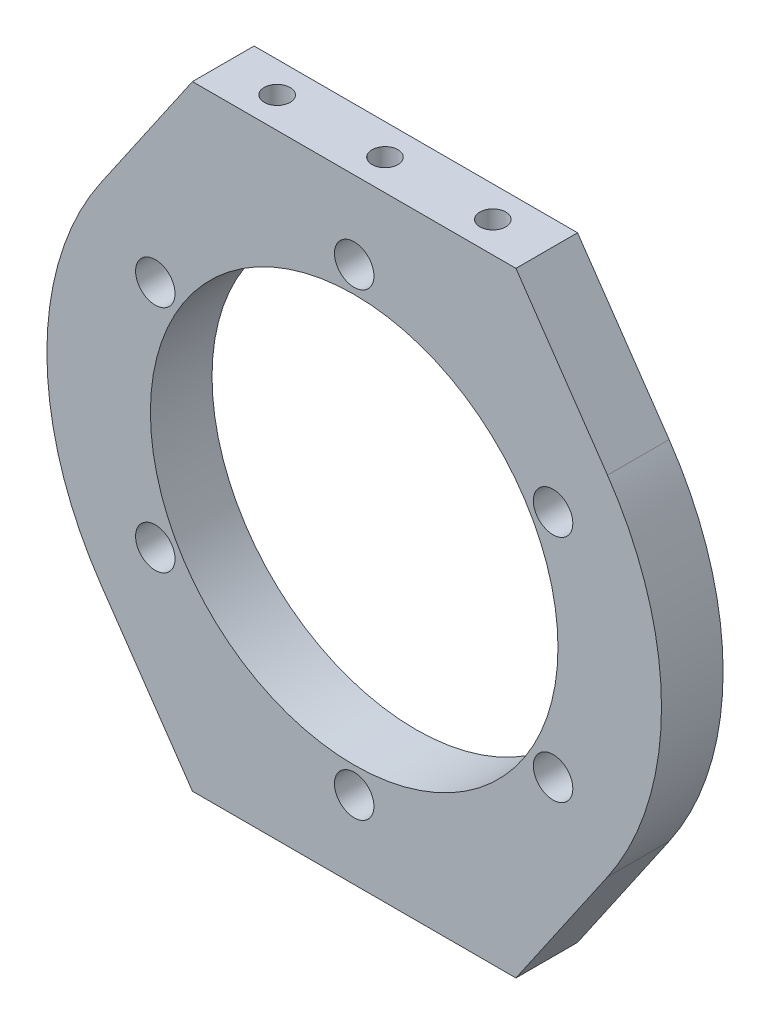
ISO-10303-21;
HEADER;
FILE_DESCRIPTION(('STEP AP214'),'2;1');
FILE_NAME('part.step','',(''),(''),'','','');
FILE_SCHEMA(('AUTOMOTIVE_DESIGN { 1 0 10303 214 1 1 1 1 }'));
ENDSEC;
DATA;
#1=APPLICATION_CONTEXT('core data for automotive mechanical design processes');
#2=APPLICATION_PROTOCOL_DEFINITION('international standard','automotive_design',2000,#1);
#3=PRODUCT_CONTEXT('',#1,'mechanical');
#4=PRODUCT('Part','Part','',(#3));
#5=PRODUCT_RELATED_PRODUCT_CATEGORY('part','',(#4));
#6=PRODUCT_DEFINITION_FORMATION('','',#4);
#7=PRODUCT_DEFINITION_CONTEXT('part definition',#1,'design');
#8=PRODUCT_DEFINITION('design','',#6,#7);
#9=PRODUCT_DEFINITION_SHAPE('','',#8);
#10=(LENGTH_UNIT() NAMED_UNIT(*) SI_UNIT(.MILLI.,.METRE.));
#11=(NAMED_UNIT(*) PLANE_ANGLE_UNIT() SI_UNIT($,.RADIAN.));
#12=(NAMED_UNIT(*) SI_UNIT($,.STERADIAN.) SOLID_ANGLE_UNIT());
#13=UNCERTAINTY_MEASURE_WITH_UNIT(LENGTH_MEASURE(1.E-05),#10,'distance_accuracy_value','');
#14=(GEOMETRIC_REPRESENTATION_CONTEXT(3) GLOBAL_UNCERTAINTY_ASSIGNED_CONTEXT((#13)) GLOBAL_UNIT_ASSIGNED_CONTEXT((#10,
#11,#12)) REPRESENTATION_CONTEXT('',''));
#15=CARTESIAN_POINT('',(0.,0.,0.));
#16=DIRECTION('',(0.,0.,1.));
#17=DIRECTION('',(1.,0.,0.));
#18=AXIS2_PLACEMENT_3D('',#15,#16,#17);
#19=CARTESIAN_POINT('',(-39.1540130151844,26.8926247288503,-9.525));
#20=DIRECTION('',(-0.824295010845986,0.566160520607376,0.));
#21=DIRECTION('',(-0.566160520607376,-0.824295010845986,0.));
#22=AXIS2_PLACEMENT_3D('',#19,#20,#21);
#23=PLANE('',#22);
#24=DIRECTION('',(-0.566160520607376,-0.824295010845986,0.));
#25=VECTOR('',#24,1.);
#26=CARTESIAN_POINT('',(-39.1540130151844,26.8926247288503,0.));
#27=LINE('',#26,#25);
#28=CARTESIAN_POINT('',(-25.,47.5,0.));
#29=VERTEX_POINT('',#28);
#30=CARTESIAN_POINT('',(-39.1540130151844,26.8926247288503,0.));
#31=VERTEX_POINT('',#30);
#32=EDGE_CURVE('E139',#29,#31,#27,.T.);
#33=ORIENTED_EDGE('',*,*,#32,.F.);
#34=DIRECTION('',(0.,0.,1.));
#35=VECTOR('',#34,1.);
#36=CARTESIAN_POINT('',(-25.,47.5,-9.525));
#37=LINE('',#36,#35);
#38=CARTESIAN_POINT('',(-25.,47.5,-9.525));
#39=VERTEX_POINT('',#38);
#40=EDGE_CURVE('E11',#39,#29,#37,.T.);
#41=ORIENTED_EDGE('',*,*,#40,.F.);
#42=DIRECTION('',(-0.566160520607376,-0.824295010845986,0.));
#43=VECTOR('',#42,1.);
#44=CARTESIAN_POINT('',(-39.1540130151844,26.8926247288503,-9.525));
#45=LINE('',#44,#43);
#46=CARTESIAN_POINT('',(-39.1540130151844,26.8926247288503,-9.525));
#47=VERTEX_POINT('',#46);
#48=EDGE_CURVE('E160',#39,#47,#45,.T.);
#49=ORIENTED_EDGE('',*,*,#48,.T.);
#50=DIRECTION('',(0.,0.,1.));
#51=VECTOR('',#50,1.);
#52=CARTESIAN_POINT('',(-39.1540130151844,26.8926247288503,-9.525));
#53=LINE('',#52,#51);
#54=EDGE_CURVE('E42',#47,#31,#53,.T.);
#55=ORIENTED_EDGE('',*,*,#54,.T.);
#56=EDGE_LOOP('',(#33,#41,#49,#55));
#57=FACE_BOUND('',#56,.T.);
#58=ADVANCED_FACE('F39',(#57),#23,.T.);
#59=CARTESIAN_POINT('',(-25.,47.5,-9.525));
#60=DIRECTION('',(0.,1.,0.));
#61=DIRECTION('',(-1.,0.,0.));
#62=AXIS2_PLACEMENT_3D('',#59,#60,#61);
#63=PLANE('',#62);
#64=CARTESIAN_POINT('',(-16.67,47.5,-4.7625));
#65=DIRECTION('',(0.,1.,0.));
#66=DIRECTION('',(0.,0.,1.));
#67=AXIS2_PLACEMENT_3D('',#64,#65,#66);
#68=CIRCLE('',#67,1.99999999999999);
#69=CARTESIAN_POINT('',(-16.67,47.5,-2.76250000000001));
#70=VERTEX_POINT('',#69);
#71=EDGE_CURVE('E310',#70,#70,#68,.T.);
#72=ORIENTED_EDGE('',*,*,#71,.F.);
#73=EDGE_LOOP('',(#72));
#74=FACE_BOUND('',#73,.T.);
#75=CARTESIAN_POINT('',(0.,47.5,-4.7625));
#76=DIRECTION('',(0.,1.,0.));
#77=DIRECTION('',(0.,0.,1.));
#78=AXIS2_PLACEMENT_3D('',#75,#76,#77);
#79=CIRCLE('',#78,1.99999999999999);
#80=CARTESIAN_POINT('',(0.,47.5,-2.76250000000001));
#81=VERTEX_POINT('',#80);
#82=EDGE_CURVE('E316',#81,#81,#79,.T.);
#83=ORIENTED_EDGE('',*,*,#82,.F.);
#84=EDGE_LOOP('',(#83));
#85=FACE_BOUND('',#84,.T.);
#86=CARTESIAN_POINT('',(16.67,47.5,-4.7625));
#87=DIRECTION('',(0.,1.,0.));
#88=DIRECTION('',(0.,0.,1.));
#89=AXIS2_PLACEMENT_3D('',#86,#87,#88);
#90=CIRCLE('',#89,1.99999999999999);
#91=CARTESIAN_POINT('',(16.67,47.5,-2.76250000000001));
#92=VERTEX_POINT('',#91);
#93=EDGE_CURVE('E322',#92,#92,#90,.T.);
#94=ORIENTED_EDGE('',*,*,#93,.F.);
#95=EDGE_LOOP('',(#94));
#96=FACE_BOUND('',#95,.T.);
#97=DIRECTION('',(-1.,0.,0.));
#98=VECTOR('',#97,1.);
#99=CARTESIAN_POINT('',(-25.,47.5,0.));
#100=LINE('',#99,#98);
#101=CARTESIAN_POINT('',(25.,47.5,0.));
#102=VERTEX_POINT('',#101);
#103=EDGE_CURVE('E158',#102,#29,#100,.T.);
#104=ORIENTED_EDGE('',*,*,#103,.F.);
#105=DIRECTION('',(0.,0.,1.));
#106=VECTOR('',#105,1.);
#107=CARTESIAN_POINT('',(25.,47.5,-9.525));
#108=LINE('',#107,#106);
#109=CARTESIAN_POINT('',(25.,47.5,-9.525));
#110=VERTEX_POINT('',#109);
#111=EDGE_CURVE('E48',#110,#102,#108,.T.);
#112=ORIENTED_EDGE('',*,*,#111,.F.);
#113=DIRECTION('',(-1.,0.,0.));
#114=VECTOR('',#113,1.);
#115=CARTESIAN_POINT('',(-25.,47.5,-9.525));
#116=LINE('',#115,#114);
#117=EDGE_CURVE('E129',#110,#39,#116,.T.);
#118=ORIENTED_EDGE('',*,*,#117,.T.);
#119=ORIENTED_EDGE('',*,*,#40,.T.);
#120=EDGE_LOOP('',(#104,#112,#118,#119));
#121=FACE_BOUND('',#120,.T.);
#122=ADVANCED_FACE('F172',(#74,#85,#96,#121),#63,.T.);
#123=CARTESIAN_POINT('',(39.1540130151844,26.8926247288503,-9.525));
#124=DIRECTION('',(0.824295010845986,0.566160520607376,0.));
#125=DIRECTION('',(-0.566160520607376,0.824295010845986,0.));
#126=AXIS2_PLACEMENT_3D('',#123,#124,#125);
#127=PLANE('',#126);
#128=DIRECTION('',(-0.566160520607376,0.824295010845986,0.));
#129=VECTOR('',#128,1.);
#130=CARTESIAN_POINT('',(39.1540130151844,26.8926247288503,0.));
#131=LINE('',#130,#129);
#132=CARTESIAN_POINT('',(39.1540130151844,26.8926247288503,0.));
#133=VERTEX_POINT('',#132);
#134=EDGE_CURVE('E116',#133,#102,#131,.T.);
#135=ORIENTED_EDGE('',*,*,#134,.F.);
#136=DIRECTION('',(0.,0.,1.));
#137=VECTOR('',#136,1.);
#138=CARTESIAN_POINT('',(39.1540130151844,26.8926247288503,-9.525));
#139=LINE('',#138,#137);
#140=CARTESIAN_POINT('',(39.1540130151844,26.8926247288503,-9.525));
#141=VERTEX_POINT('',#140);
#142=EDGE_CURVE('E111',#141,#133,#139,.T.);
#143=ORIENTED_EDGE('',*,*,#142,.F.);
#144=DIRECTION('',(-0.566160520607376,0.824295010845986,0.));
#145=VECTOR('',#144,1.);
#146=CARTESIAN_POINT('',(39.1540130151844,26.8926247288503,-9.525));
#147=LINE('',#146,#145);
#148=EDGE_CURVE('E114',#141,#110,#147,.T.);
#149=ORIENTED_EDGE('',*,*,#148,.T.);
#150=ORIENTED_EDGE('',*,*,#111,.T.);
#151=EDGE_LOOP('',(#135,#143,#149,#150));
#152=FACE_BOUND('',#151,.T.);
#153=ADVANCED_FACE('F113',(#152),#127,.T.);
#154=CARTESIAN_POINT('',(0.,0.,-9.525));
#155=DIRECTION('',(0.,0.,1.));
#156=DIRECTION('',(1.,0.,0.));
#157=AXIS2_PLACEMENT_3D('',#154,#155,#156);
#158=CYLINDRICAL_SURFACE('',#157,47.5);
#159=CARTESIAN_POINT('',(0.,0.,0.));
#160=DIRECTION('',(0.,0.,1.));
#161=DIRECTION('',(1.,0.,0.));
#162=AXIS2_PLACEMENT_3D('',#159,#160,#161);
#163=CIRCLE('',#162,47.5);
#164=CARTESIAN_POINT('',(39.1540130151844,-26.8926247288503,0.));
#165=VERTEX_POINT('',#164);
#166=EDGE_CURVE('E155',#165,#133,#163,.T.);
#167=ORIENTED_EDGE('',*,*,#166,.F.);
#168=DIRECTION('',(0.,0.,1.));
#169=VECTOR('',#168,1.);
#170=CARTESIAN_POINT('',(39.1540130151844,-26.8926247288503,-9.525));
#171=LINE('',#170,#169);
#172=CARTESIAN_POINT('',(39.1540130151844,-26.8926247288503,-9.525));
#173=VERTEX_POINT('',#172);
#174=EDGE_CURVE('E121',#173,#165,#171,.T.);
#175=ORIENTED_EDGE('',*,*,#174,.F.);
#176=CARTESIAN_POINT('',(0.,0.,-9.525));
#177=DIRECTION('',(0.,0.,1.));
#178=DIRECTION('',(1.,0.,0.));
#179=AXIS2_PLACEMENT_3D('',#176,#177,#178);
#180=CIRCLE('',#179,47.5);
#181=EDGE_CURVE('E127',#173,#141,#180,.T.);
#182=ORIENTED_EDGE('',*,*,#181,.T.);
#183=ORIENTED_EDGE('',*,*,#142,.T.);
#184=EDGE_LOOP('',(#167,#175,#182,#183));
#185=FACE_BOUND('',#184,.T.);
#186=ADVANCED_FACE('F131',(#185),#158,.T.);
#187=CARTESIAN_POINT('',(39.1540130151844,-26.8926247288503,-9.525));
#188=DIRECTION('',(0.824295010845986,-0.566160520607376,0.));
#189=DIRECTION('',(0.566160520607376,0.824295010845986,0.));
#190=AXIS2_PLACEMENT_3D('',#187,#188,#189);
#191=PLANE('',#190);
#192=DIRECTION('',(0.566160520607376,0.824295010845986,0.));
#193=VECTOR('',#192,1.);
#194=CARTESIAN_POINT('',(39.1540130151844,-26.8926247288503,0.));
#195=LINE('',#194,#193);
#196=CARTESIAN_POINT('',(25.,-47.5,0.));
#197=VERTEX_POINT('',#196);
#198=EDGE_CURVE('E152',#197,#165,#195,.T.);
#199=ORIENTED_EDGE('',*,*,#198,.F.);
#200=DIRECTION('',(0.,0.,1.));
#201=VECTOR('',#200,1.);
#202=CARTESIAN_POINT('',(25.,-47.5,-9.525));
#203=LINE('',#202,#201);
#204=CARTESIAN_POINT('',(25.,-47.5,-9.525));
#205=VERTEX_POINT('',#204);
#206=EDGE_CURVE('E164',#205,#197,#203,.T.);
#207=ORIENTED_EDGE('',*,*,#206,.F.);
#208=DIRECTION('',(0.566160520607376,0.824295010845986,0.));
#209=VECTOR('',#208,1.);
#210=CARTESIAN_POINT('',(39.1540130151844,-26.8926247288503,-9.525));
#211=LINE('',#210,#209);
#212=EDGE_CURVE('E132',#205,#173,#211,.T.);
#213=ORIENTED_EDGE('',*,*,#212,.T.);
#214=ORIENTED_EDGE('',*,*,#174,.T.);
#215=EDGE_LOOP('',(#199,#207,#213,#214));
#216=FACE_BOUND('',#215,.T.);
#217=ADVANCED_FACE('F190',(#216),#191,.T.);
#218=CARTESIAN_POINT('',(-25.,-47.5,-9.525));
#219=DIRECTION('',(0.,-1.,0.));
#220=DIRECTION('',(1.,0.,0.));
#221=AXIS2_PLACEMENT_3D('',#218,#219,#220);
#222=PLANE('',#221);
#223=CARTESIAN_POINT('',(0.,-47.5,-4.7625));
#224=DIRECTION('',(0.,-1.,0.));
#225=DIRECTION('',(0.,0.,-1.));
#226=AXIS2_PLACEMENT_3D('',#223,#224,#225);
#227=CIRCLE('',#226,1.99999999999999);
#228=CARTESIAN_POINT('',(0.,-47.5,-6.76249999999999));
#229=VERTEX_POINT('',#228);
#230=EDGE_CURVE('E294',#229,#229,#227,.T.);
#231=ORIENTED_EDGE('',*,*,#230,.F.);
#232=EDGE_LOOP('',(#231));
#233=FACE_BOUND('',#232,.T.);
#234=CARTESIAN_POINT('',(-16.67,-47.5,-4.7625));
#235=DIRECTION('',(0.,-1.,0.));
#236=DIRECTION('',(0.,0.,-1.));
#237=AXIS2_PLACEMENT_3D('',#234,#235,#236);
#238=CIRCLE('',#237,1.99999999999999);
#239=CARTESIAN_POINT('',(-16.67,-47.5,-6.76249999999999));
#240=VERTEX_POINT('',#239);
#241=EDGE_CURVE('E296',#240,#240,#238,.T.);
#242=ORIENTED_EDGE('',*,*,#241,.F.);
#243=EDGE_LOOP('',(#242));
#244=FACE_BOUND('',#243,.T.);
#245=CARTESIAN_POINT('',(16.67,-47.5,-4.7625));
#246=DIRECTION('',(0.,-1.,0.));
#247=DIRECTION('',(0.,0.,-1.));
#248=AXIS2_PLACEMENT_3D('',#245,#246,#247);
#249=CIRCLE('',#248,1.99999999999999);
#250=CARTESIAN_POINT('',(16.67,-47.5,-6.76249999999999));
#251=VERTEX_POINT('',#250);
#252=EDGE_CURVE('E304',#251,#251,#249,.T.);
#253=ORIENTED_EDGE('',*,*,#252,.F.);
#254=EDGE_LOOP('',(#253));
#255=FACE_BOUND('',#254,.T.);
#256=DIRECTION('',(1.,0.,0.));
#257=VECTOR('',#256,1.);
#258=CARTESIAN_POINT('',(-25.,-47.5,0.));
#259=LINE('',#258,#257);
#260=CARTESIAN_POINT('',(-25.,-47.5,0.));
#261=VERTEX_POINT('',#260);
#262=EDGE_CURVE('E149',#261,#197,#259,.T.);
#263=ORIENTED_EDGE('',*,*,#262,.F.);
#264=DIRECTION('',(0.,0.,1.));
#265=VECTOR('',#264,1.);
#266=CARTESIAN_POINT('',(-25.,-47.5,-9.525));
#267=LINE('',#266,#265);
#268=CARTESIAN_POINT('',(-25.,-47.5,-9.525));
#269=VERTEX_POINT('',#268);
#270=EDGE_CURVE('E166',#269,#261,#267,.T.);
#271=ORIENTED_EDGE('',*,*,#270,.F.);
#272=DIRECTION('',(1.,0.,0.));
#273=VECTOR('',#272,1.);
#274=CARTESIAN_POINT('',(-25.,-47.5,-9.525));
#275=LINE('',#274,#273);
#276=EDGE_CURVE('E134',#269,#205,#275,.T.);
#277=ORIENTED_EDGE('',*,*,#276,.T.);
#278=ORIENTED_EDGE('',*,*,#206,.T.);
#279=EDGE_LOOP('',(#263,#271,#277,#278));
#280=FACE_BOUND('',#279,.T.);
#281=ADVANCED_FACE('F193',(#233,#244,#255,#280),#222,.T.);
#282=CARTESIAN_POINT('',(-39.1540130151844,-26.8926247288504,-9.525));
#283=DIRECTION('',(-0.824295010845986,-0.566160520607376,0.));
#284=DIRECTION('',(0.566160520607376,-0.824295010845986,0.));
#285=AXIS2_PLACEMENT_3D('',#282,#283,#284);
#286=PLANE('',#285);
#287=DIRECTION('',(0.566160520607376,-0.824295010845986,0.));
#288=VECTOR('',#287,1.);
#289=CARTESIAN_POINT('',(-39.1540130151844,-26.8926247288504,0.));
#290=LINE('',#289,#288);
#291=CARTESIAN_POINT('',(-39.1540130151844,-26.8926247288504,0.));
#292=VERTEX_POINT('',#291);
#293=EDGE_CURVE('E146',#292,#261,#290,.T.);
#294=ORIENTED_EDGE('',*,*,#293,.F.);
#295=DIRECTION('',(0.,0.,1.));
#296=VECTOR('',#295,1.);
#297=CARTESIAN_POINT('',(-39.1540130151844,-26.8926247288504,-9.525));
#298=LINE('',#297,#296);
#299=CARTESIAN_POINT('',(-39.1540130151844,-26.8926247288504,-9.525));
#300=VERTEX_POINT('',#299);
#301=EDGE_CURVE('E167',#300,#292,#298,.T.);
#302=ORIENTED_EDGE('',*,*,#301,.F.);
#303=DIRECTION('',(0.566160520607376,-0.824295010845986,0.));
#304=VECTOR('',#303,1.);
#305=CARTESIAN_POINT('',(-39.1540130151844,-26.8926247288504,-9.525));
#306=LINE('',#305,#304);
#307=EDGE_CURVE('E372',#300,#269,#306,.T.);
#308=ORIENTED_EDGE('',*,*,#307,.T.);
#309=ORIENTED_EDGE('',*,*,#270,.T.);
#310=EDGE_LOOP('',(#294,#302,#308,#309));
#311=FACE_BOUND('',#310,.T.);
#312=ADVANCED_FACE('F197',(#311),#286,.T.);
#313=CARTESIAN_POINT('',(0.,0.,-9.525));
#314=DIRECTION('',(0.,0.,1.));
#315=DIRECTION('',(1.,0.,0.));
#316=AXIS2_PLACEMENT_3D('',#313,#314,#315);
#317=CYLINDRICAL_SURFACE('',#316,47.5);
#318=CARTESIAN_POINT('',(0.,0.,0.));
#319=DIRECTION('',(0.,0.,1.));
#320=DIRECTION('',(1.,0.,0.));
#321=AXIS2_PLACEMENT_3D('',#318,#319,#320);
#322=CIRCLE('',#321,47.5);
#323=EDGE_CURVE('E142',#31,#292,#322,.T.);
#324=ORIENTED_EDGE('',*,*,#323,.F.);
#325=ORIENTED_EDGE('',*,*,#54,.F.);
#326=CARTESIAN_POINT('',(0.,0.,-9.525));
#327=DIRECTION('',(0.,0.,1.));
#328=DIRECTION('',(1.,0.,0.));
#329=AXIS2_PLACEMENT_3D('',#326,#327,#328);
#330=CIRCLE('',#329,47.5);
#331=EDGE_CURVE('E370',#47,#300,#330,.T.);
#332=ORIENTED_EDGE('',*,*,#331,.T.);
#333=ORIENTED_EDGE('',*,*,#301,.T.);
#334=EDGE_LOOP('',(#324,#325,#332,#333));
#335=FACE_BOUND('',#334,.T.);
#336=ADVANCED_FACE('F169',(#335),#317,.T.);
#337=CARTESIAN_POINT('',(0.,0.,-9.525));
#338=DIRECTION('',(0.,0.,1.));
#339=DIRECTION('',(1.,0.,0.));
#340=AXIS2_PLACEMENT_3D('',#337,#338,#339);
#341=PLANE('',#340);
#342=CARTESIAN_POINT('',(0.,0.,-9.525));
#343=DIRECTION('',(0.,0.,-1.));
#344=DIRECTION('',(-1.,0.,0.));
#345=AXIS2_PLACEMENT_3D('',#342,#343,#344);
#346=CIRCLE('',#345,31.5);
#347=CARTESIAN_POINT('',(-31.5,0.,-9.525));
#348=VERTEX_POINT('',#347);
#349=EDGE_CURVE('E328',#348,#348,#346,.T.);
#350=ORIENTED_EDGE('',*,*,#349,.F.);
#351=EDGE_LOOP('',(#350));
#352=FACE_BOUND('',#351,.T.);
#353=CARTESIAN_POINT('',(0.,35.5,-9.525));
#354=DIRECTION('',(0.,0.,1.));
#355=DIRECTION('',(1.,0.,0.));
#356=AXIS2_PLACEMENT_3D('',#353,#354,#355);
#357=CIRCLE('',#356,3.05);
#358=CARTESIAN_POINT('',(3.05,35.5,-9.525));
#359=VERTEX_POINT('',#358);
#360=EDGE_CURVE('E337',#359,#359,#357,.T.);
#361=ORIENTED_EDGE('',*,*,#360,.T.);
#362=EDGE_LOOP('',(#361));
#363=FACE_BOUND('',#362,.T.);
#364=CARTESIAN_POINT('',(30.7439018343476,17.75,-9.525));
#365=DIRECTION('',(0.,0.,1.));
#366=DIRECTION('',(1.,0.,0.));
#367=AXIS2_PLACEMENT_3D('',#364,#365,#366);
#368=CIRCLE('',#367,3.05);
#369=CARTESIAN_POINT('',(33.7939018343476,17.75,-9.525));
#370=VERTEX_POINT('',#369);
#371=EDGE_CURVE('E343',#370,#370,#368,.T.);
#372=ORIENTED_EDGE('',*,*,#371,.T.);
#373=EDGE_LOOP('',(#372));
#374=FACE_BOUND('',#373,.T.);
#375=CARTESIAN_POINT('',(30.7439018343476,-17.75,-9.525));
#376=DIRECTION('',(0.,0.,1.));
#377=DIRECTION('',(1.,0.,0.));
#378=AXIS2_PLACEMENT_3D('',#375,#376,#377);
#379=CIRCLE('',#378,3.05);
#380=CARTESIAN_POINT('',(33.7939018343476,-17.75,-9.525));
#381=VERTEX_POINT('',#380);
#382=EDGE_CURVE('E349',#381,#381,#379,.T.);
#383=ORIENTED_EDGE('',*,*,#382,.T.);
#384=EDGE_LOOP('',(#383));
#385=FACE_BOUND('',#384,.T.);
#386=CARTESIAN_POINT('',(0.,-35.5,-9.525));
#387=DIRECTION('',(0.,0.,1.));
#388=DIRECTION('',(1.,0.,0.));
#389=AXIS2_PLACEMENT_3D('',#386,#387,#388);
#390=CIRCLE('',#389,3.05);
#391=CARTESIAN_POINT('',(3.05,-35.5,-9.525));
#392=VERTEX_POINT('',#391);
#393=EDGE_CURVE('E355',#392,#392,#390,.T.);
#394=ORIENTED_EDGE('',*,*,#393,.T.);
#395=EDGE_LOOP('',(#394));
#396=FACE_BOUND('',#395,.T.);
#397=CARTESIAN_POINT('',(-30.7439018343476,-17.75,-9.525));
#398=DIRECTION('',(0.,0.,1.));
#399=DIRECTION('',(1.,0.,0.));
#400=AXIS2_PLACEMENT_3D('',#397,#398,#399);
#401=CIRCLE('',#400,3.05);
#402=CARTESIAN_POINT('',(-27.6939018343476,-17.75,-9.525));
#403=VERTEX_POINT('',#402);
#404=EDGE_CURVE('E361',#403,#403,#401,.T.);
#405=ORIENTED_EDGE('',*,*,#404,.T.);
#406=EDGE_LOOP('',(#405));
#407=FACE_BOUND('',#406,.T.);
#408=CARTESIAN_POINT('',(-30.7439018343476,17.75,-9.525));
#409=DIRECTION('',(0.,0.,1.));
#410=DIRECTION('',(1.,0.,0.));
#411=AXIS2_PLACEMENT_3D('',#408,#409,#410);
#412=CIRCLE('',#411,3.05);
#413=CARTESIAN_POINT('',(-27.6939018343476,17.75,-9.525));
#414=VERTEX_POINT('',#413);
#415=EDGE_CURVE('E143',#414,#414,#412,.T.);
#416=ORIENTED_EDGE('',*,*,#415,.T.);
#417=EDGE_LOOP('',(#416));
#418=FACE_BOUND('',#417,.T.);
#419=ORIENTED_EDGE('',*,*,#48,.F.);
#420=ORIENTED_EDGE('',*,*,#117,.F.);
#421=ORIENTED_EDGE('',*,*,#148,.F.);
#422=ORIENTED_EDGE('',*,*,#181,.F.);
#423=ORIENTED_EDGE('',*,*,#212,.F.);
#424=ORIENTED_EDGE('',*,*,#276,.F.);
#425=ORIENTED_EDGE('',*,*,#307,.F.);
#426=ORIENTED_EDGE('',*,*,#331,.F.);
#427=EDGE_LOOP('',(#419,#420,#421,#422,#423,#424,#425,#426));
#428=FACE_BOUND('',#427,.T.);
#429=ADVANCED_FACE('F125',(#352,#363,#374,#385,#396,#407,#418,#428),#341,.F.);
#430=CARTESIAN_POINT('',(0.,0.,0.));
#431=DIRECTION('',(0.,0.,1.));
#432=DIRECTION('',(1.,0.,0.));
#433=AXIS2_PLACEMENT_3D('',#430,#431,#432);
#434=PLANE('',#433);
#435=CARTESIAN_POINT('',(0.,0.,0.));
#436=DIRECTION('',(0.,0.,-1.));
#437=DIRECTION('',(-1.,0.,0.));
#438=AXIS2_PLACEMENT_3D('',#435,#436,#437);
#439=CIRCLE('',#438,31.5);
#440=CARTESIAN_POINT('',(-31.5,0.,0.));
#441=VERTEX_POINT('',#440);
#442=EDGE_CURVE('E329',#441,#441,#439,.T.);
#443=ORIENTED_EDGE('',*,*,#442,.T.);
#444=EDGE_LOOP('',(#443));
#445=FACE_BOUND('',#444,.T.);
#446=CARTESIAN_POINT('',(0.,35.5,0.));
#447=DIRECTION('',(0.,0.,1.));
#448=DIRECTION('',(1.,0.,0.));
#449=AXIS2_PLACEMENT_3D('',#446,#447,#448);
#450=CIRCLE('',#449,3.04999999999999);
#451=CARTESIAN_POINT('',(3.04999999999999,35.5,0.));
#452=VERTEX_POINT('',#451);
#453=EDGE_CURVE('E332',#452,#452,#450,.T.);
#454=ORIENTED_EDGE('',*,*,#453,.F.);
#455=EDGE_LOOP('',(#454));
#456=FACE_BOUND('',#455,.T.);
#457=CARTESIAN_POINT('',(30.7439018343476,17.75,0.));
#458=DIRECTION('',(0.,0.,1.));
#459=DIRECTION('',(1.,0.,0.));
#460=AXIS2_PLACEMENT_3D('',#457,#458,#459);
#461=CIRCLE('',#460,3.04999999999998);
#462=CARTESIAN_POINT('',(33.7939018343476,17.75,0.));
#463=VERTEX_POINT('',#462);
#464=EDGE_CURVE('E340',#463,#463,#461,.T.);
#465=ORIENTED_EDGE('',*,*,#464,.F.);
#466=EDGE_LOOP('',(#465));
#467=FACE_BOUND('',#466,.T.);
#468=CARTESIAN_POINT('',(30.7439018343476,-17.75,0.));
#469=DIRECTION('',(0.,0.,1.));
#470=DIRECTION('',(1.,0.,0.));
#471=AXIS2_PLACEMENT_3D('',#468,#469,#470);
#472=CIRCLE('',#471,3.04999999999999);
#473=CARTESIAN_POINT('',(33.7939018343476,-17.75,0.));
#474=VERTEX_POINT('',#473);
#475=EDGE_CURVE('E346',#474,#474,#472,.T.);
#476=ORIENTED_EDGE('',*,*,#475,.F.);
#477=EDGE_LOOP('',(#476));
#478=FACE_BOUND('',#477,.T.);
#479=CARTESIAN_POINT('',(0.,-35.5,0.));
#480=DIRECTION('',(0.,0.,1.));
#481=DIRECTION('',(1.,0.,0.));
#482=AXIS2_PLACEMENT_3D('',#479,#480,#481);
#483=CIRCLE('',#482,3.04999999999999);
#484=CARTESIAN_POINT('',(3.04999999999999,-35.5,0.));
#485=VERTEX_POINT('',#484);
#486=EDGE_CURVE('E352',#485,#485,#483,.T.);
#487=ORIENTED_EDGE('',*,*,#486,.F.);
#488=EDGE_LOOP('',(#487));
#489=FACE_BOUND('',#488,.T.);
#490=CARTESIAN_POINT('',(-30.7439018343476,-17.75,0.));
#491=DIRECTION('',(0.,0.,1.));
#492=DIRECTION('',(1.,0.,0.));
#493=AXIS2_PLACEMENT_3D('',#490,#491,#492);
#494=CIRCLE('',#493,3.04999999999999);
#495=CARTESIAN_POINT('',(-27.6939018343476,-17.75,0.));
#496=VERTEX_POINT('',#495);
#497=EDGE_CURVE('E358',#496,#496,#494,.T.);
#498=ORIENTED_EDGE('',*,*,#497,.F.);
#499=EDGE_LOOP('',(#498));
#500=FACE_BOUND('',#499,.T.);
#501=CARTESIAN_POINT('',(-30.7439018343476,17.75,0.));
#502=DIRECTION('',(0.,0.,1.));
#503=DIRECTION('',(1.,0.,0.));
#504=AXIS2_PLACEMENT_3D('',#501,#502,#503);
#505=CIRCLE('',#504,3.04999999999999);
#506=CARTESIAN_POINT('',(-27.6939018343476,17.75,0.));
#507=VERTEX_POINT('',#506);
#508=EDGE_CURVE('E364',#507,#507,#505,.T.);
#509=ORIENTED_EDGE('',*,*,#508,.F.);
#510=EDGE_LOOP('',(#509));
#511=FACE_BOUND('',#510,.T.);
#512=ORIENTED_EDGE('',*,*,#32,.T.);
#513=ORIENTED_EDGE('',*,*,#323,.T.);
#514=ORIENTED_EDGE('',*,*,#293,.T.);
#515=ORIENTED_EDGE('',*,*,#262,.T.);
#516=ORIENTED_EDGE('',*,*,#198,.T.);
#517=ORIENTED_EDGE('',*,*,#166,.T.);
#518=ORIENTED_EDGE('',*,*,#134,.T.);
#519=ORIENTED_EDGE('',*,*,#103,.T.);
#520=EDGE_LOOP('',(#512,#513,#514,#515,#516,#517,#518,#519));
#521=FACE_BOUND('',#520,.T.);
#522=ADVANCED_FACE('F171',(#445,#456,#467,#478,#489,#500,#511,#521),#434,.T.);
#523=CARTESIAN_POINT('',(-30.7439018343476,17.75,0.));
#524=DIRECTION('',(0.,0.,1.));
#525=DIRECTION('',(1.,0.,0.));
#526=AXIS2_PLACEMENT_3D('',#523,#524,#525);
#527=CYLINDRICAL_SURFACE('',#526,3.04999999999999);
#528=ORIENTED_EDGE('',*,*,#415,.F.);
#529=EDGE_LOOP('',(#528));
#530=FACE_BOUND('',#529,.T.);
#531=ORIENTED_EDGE('',*,*,#508,.T.);
#532=EDGE_LOOP('',(#531));
#533=FACE_BOUND('',#532,.T.);
#534=ADVANCED_FACE('F211',(#530,#533),#527,.F.);
#535=CARTESIAN_POINT('',(-30.7439018343476,-17.75,0.));
#536=DIRECTION('',(0.,0.,1.));
#537=DIRECTION('',(1.,0.,0.));
#538=AXIS2_PLACEMENT_3D('',#535,#536,#537);
#539=CYLINDRICAL_SURFACE('',#538,3.04999999999999);
#540=ORIENTED_EDGE('',*,*,#404,.F.);
#541=EDGE_LOOP('',(#540));
#542=FACE_BOUND('',#541,.T.);
#543=ORIENTED_EDGE('',*,*,#497,.T.);
#544=EDGE_LOOP('',(#543));
#545=FACE_BOUND('',#544,.T.);
#546=ADVANCED_FACE('F217',(#542,#545),#539,.F.);
#547=CARTESIAN_POINT('',(0.,-35.5,0.));
#548=DIRECTION('',(0.,0.,1.));
#549=DIRECTION('',(1.,0.,0.));
#550=AXIS2_PLACEMENT_3D('',#547,#548,#549);
#551=CYLINDRICAL_SURFACE('',#550,3.04999999999999);
#552=ORIENTED_EDGE('',*,*,#393,.F.);
#553=EDGE_LOOP('',(#552));
#554=FACE_BOUND('',#553,.T.);
#555=ORIENTED_EDGE('',*,*,#486,.T.);
#556=EDGE_LOOP('',(#555));
#557=FACE_BOUND('',#556,.T.);
#558=ADVANCED_FACE('F221',(#554,#557),#551,.F.);
#559=CARTESIAN_POINT('',(30.7439018343476,-17.75,0.));
#560=DIRECTION('',(0.,0.,1.));
#561=DIRECTION('',(1.,0.,0.));
#562=AXIS2_PLACEMENT_3D('',#559,#560,#561);
#563=CYLINDRICAL_SURFACE('',#562,3.04999999999999);
#564=ORIENTED_EDGE('',*,*,#382,.F.);
#565=EDGE_LOOP('',(#564));
#566=FACE_BOUND('',#565,.T.);
#567=ORIENTED_EDGE('',*,*,#475,.T.);
#568=EDGE_LOOP('',(#567));
#569=FACE_BOUND('',#568,.T.);
#570=ADVANCED_FACE('F225',(#566,#569),#563,.F.);
#571=CARTESIAN_POINT('',(30.7439018343476,17.75,0.));
#572=DIRECTION('',(0.,0.,1.));
#573=DIRECTION('',(1.,0.,0.));
#574=AXIS2_PLACEMENT_3D('',#571,#572,#573);
#575=CYLINDRICAL_SURFACE('',#574,3.04999999999999);
#576=ORIENTED_EDGE('',*,*,#371,.F.);
#577=EDGE_LOOP('',(#576));
#578=FACE_BOUND('',#577,.T.);
#579=ORIENTED_EDGE('',*,*,#464,.T.);
#580=EDGE_LOOP('',(#579));
#581=FACE_BOUND('',#580,.T.);
#582=ADVANCED_FACE('F229',(#578,#581),#575,.F.);
#583=CARTESIAN_POINT('',(0.,35.5,0.));
#584=DIRECTION('',(0.,0.,1.));
#585=DIRECTION('',(1.,0.,0.));
#586=AXIS2_PLACEMENT_3D('',#583,#584,#585);
#587=CYLINDRICAL_SURFACE('',#586,3.04999999999999);
#588=ORIENTED_EDGE('',*,*,#360,.F.);
#589=EDGE_LOOP('',(#588));
#590=FACE_BOUND('',#589,.T.);
#591=ORIENTED_EDGE('',*,*,#453,.T.);
#592=EDGE_LOOP('',(#591));
#593=FACE_BOUND('',#592,.T.);
#594=ADVANCED_FACE('F233',(#590,#593),#587,.F.);
#595=CARTESIAN_POINT('',(0.,0.,0.));
#596=DIRECTION('',(0.,0.,-1.));
#597=DIRECTION('',(-1.,0.,0.));
#598=AXIS2_PLACEMENT_3D('',#595,#596,#597);
#599=CYLINDRICAL_SURFACE('',#598,31.5);
#600=ORIENTED_EDGE('',*,*,#442,.F.);
#601=EDGE_LOOP('',(#600));
#602=FACE_BOUND('',#601,.T.);
#603=ORIENTED_EDGE('',*,*,#349,.T.);
#604=EDGE_LOOP('',(#603));
#605=FACE_BOUND('',#604,.T.);
#606=ADVANCED_FACE('F236',(#602,#605),#599,.F.);
#607=CARTESIAN_POINT('',(16.67,44.3,-4.7625));
#608=DIRECTION('',(0.,1.,0.));
#609=DIRECTION('',(0.,0.,1.));
#610=AXIS2_PLACEMENT_3D('',#607,#608,#609);
#611=CONICAL_SURFACE('',#610,1.99999999999999,1.02974425867665);
#612=CARTESIAN_POINT('',(16.67,43.0982787619449,-4.7625));
#613=VERTEX_POINT('',#612);
#614=VERTEX_LOOP('',#613);
#615=FACE_BOUND('',#614,.T.);
#616=CARTESIAN_POINT('',(16.67,44.3,-4.7625));
#617=DIRECTION('',(0.,1.,0.));
#618=DIRECTION('',(0.,0.,1.));
#619=AXIS2_PLACEMENT_3D('',#616,#617,#618);
#620=CIRCLE('',#619,1.99999999999999);
#621=CARTESIAN_POINT('',(16.67,44.3,-2.76250000000001));
#622=VERTEX_POINT('',#621);
#623=EDGE_CURVE('E325',#622,#622,#620,.T.);
#624=ORIENTED_EDGE('',*,*,#623,.T.);
#625=EDGE_LOOP('',(#624));
#626=FACE_BOUND('',#625,.T.);
#627=ADVANCED_FACE('F239',(#615,#626),#611,.F.);
#628=CARTESIAN_POINT('',(16.67,47.5,-4.7625));
#629=DIRECTION('',(0.,1.,0.));
#630=DIRECTION('',(0.,0.,1.));
#631=AXIS2_PLACEMENT_3D('',#628,#629,#630);
#632=CYLINDRICAL_SURFACE('',#631,1.99999999999999);
#633=ORIENTED_EDGE('',*,*,#623,.F.);
#634=EDGE_LOOP('',(#633));
#635=FACE_BOUND('',#634,.T.);
#636=ORIENTED_EDGE('',*,*,#93,.T.);
#637=EDGE_LOOP('',(#636));
#638=FACE_BOUND('',#637,.T.);
#639=ADVANCED_FACE('F242',(#635,#638),#632,.F.);
#640=CARTESIAN_POINT('',(0.,44.3,-4.7625));
#641=DIRECTION('',(0.,1.,0.));
#642=DIRECTION('',(0.,0.,1.));
#643=AXIS2_PLACEMENT_3D('',#640,#641,#642);
#644=CONICAL_SURFACE('',#643,1.99999999999999,1.02974425867665);
#645=CARTESIAN_POINT('',(0.,43.0982787619449,-4.7625));
#646=VERTEX_POINT('',#645);
#647=VERTEX_LOOP('',#646);
#648=FACE_BOUND('',#647,.T.);
#649=CARTESIAN_POINT('',(0.,44.3,-4.7625));
#650=DIRECTION('',(0.,1.,0.));
#651=DIRECTION('',(0.,0.,1.));
#652=AXIS2_PLACEMENT_3D('',#649,#650,#651);
#653=CIRCLE('',#652,1.99999999999999);
#654=CARTESIAN_POINT('',(0.,44.3,-2.76250000000001));
#655=VERTEX_POINT('',#654);
#656=EDGE_CURVE('E319',#655,#655,#653,.T.);
#657=ORIENTED_EDGE('',*,*,#656,.T.);
#658=EDGE_LOOP('',(#657));
#659=FACE_BOUND('',#658,.T.);
#660=ADVANCED_FACE('F246',(#648,#659),#644,.F.);
#661=CARTESIAN_POINT('',(0.,47.5,-4.7625));
#662=DIRECTION('',(0.,1.,0.));
#663=DIRECTION('',(0.,0.,1.));
#664=AXIS2_PLACEMENT_3D('',#661,#662,#663);
#665=CYLINDRICAL_SURFACE('',#664,1.99999999999999);
#666=ORIENTED_EDGE('',*,*,#656,.F.);
#667=EDGE_LOOP('',(#666));
#668=FACE_BOUND('',#667,.T.);
#669=ORIENTED_EDGE('',*,*,#82,.T.);
#670=EDGE_LOOP('',(#669));
#671=FACE_BOUND('',#670,.T.);
#672=ADVANCED_FACE('F250',(#668,#671),#665,.F.);
#673=CARTESIAN_POINT('',(-16.67,44.3,-4.7625));
#674=DIRECTION('',(0.,1.,0.));
#675=DIRECTION('',(0.,0.,1.));
#676=AXIS2_PLACEMENT_3D('',#673,#674,#675);
#677=CONICAL_SURFACE('',#676,1.99999999999999,1.02974425867665);
#678=CARTESIAN_POINT('',(-16.67,43.0982787619449,-4.7625));
#679=VERTEX_POINT('',#678);
#680=VERTEX_LOOP('',#679);
#681=FACE_BOUND('',#680,.T.);
#682=CARTESIAN_POINT('',(-16.67,44.3,-4.7625));
#683=DIRECTION('',(0.,1.,0.));
#684=DIRECTION('',(0.,0.,1.));
#685=AXIS2_PLACEMENT_3D('',#682,#683,#684);
#686=CIRCLE('',#685,1.99999999999999);
#687=CARTESIAN_POINT('',(-16.67,44.3,-2.76250000000001));
#688=VERTEX_POINT('',#687);
#689=EDGE_CURVE('E313',#688,#688,#686,.T.);
#690=ORIENTED_EDGE('',*,*,#689,.T.);
#691=EDGE_LOOP('',(#690));
#692=FACE_BOUND('',#691,.T.);
#693=ADVANCED_FACE('F254',(#681,#692),#677,.F.);
#694=CARTESIAN_POINT('',(-16.67,47.5,-4.7625));
#695=DIRECTION('',(0.,1.,0.));
#696=DIRECTION('',(0.,0.,1.));
#697=AXIS2_PLACEMENT_3D('',#694,#695,#696);
#698=CYLINDRICAL_SURFACE('',#697,1.99999999999999);
#699=ORIENTED_EDGE('',*,*,#689,.F.);
#700=EDGE_LOOP('',(#699));
#701=FACE_BOUND('',#700,.T.);
#702=ORIENTED_EDGE('',*,*,#71,.T.);
#703=EDGE_LOOP('',(#702));
#704=FACE_BOUND('',#703,.T.);
#705=ADVANCED_FACE('F258',(#701,#704),#698,.F.);
#706=CARTESIAN_POINT('',(16.67,-44.3,-4.7625));
#707=DIRECTION('',(0.,-1.,0.));
#708=DIRECTION('',(0.,0.,-1.));
#709=AXIS2_PLACEMENT_3D('',#706,#707,#708);
#710=CONICAL_SURFACE('',#709,1.99999999999999,1.02974425867665);
#711=CARTESIAN_POINT('',(16.67,-43.0982787619449,-4.7625));
#712=VERTEX_POINT('',#711);
#713=VERTEX_LOOP('',#712);
#714=FACE_BOUND('',#713,.T.);
#715=CARTESIAN_POINT('',(16.67,-44.3,-4.7625));
#716=DIRECTION('',(0.,-1.,0.));
#717=DIRECTION('',(0.,0.,-1.));
#718=AXIS2_PLACEMENT_3D('',#715,#716,#717);
#719=CIRCLE('',#718,1.99999999999999);
#720=CARTESIAN_POINT('',(16.67,-44.3,-6.76249999999999));
#721=VERTEX_POINT('',#720);
#722=EDGE_CURVE('E307',#721,#721,#719,.T.);
#723=ORIENTED_EDGE('',*,*,#722,.T.);
#724=EDGE_LOOP('',(#723));
#725=FACE_BOUND('',#724,.T.);
#726=ADVANCED_FACE('F262',(#714,#725),#710,.F.);
#727=CARTESIAN_POINT('',(16.67,-47.5,-4.7625));
#728=DIRECTION('',(0.,-1.,0.));
#729=DIRECTION('',(0.,0.,-1.));
#730=AXIS2_PLACEMENT_3D('',#727,#728,#729);
#731=CYLINDRICAL_SURFACE('',#730,1.99999999999999);
#732=ORIENTED_EDGE('',*,*,#722,.F.);
#733=EDGE_LOOP('',(#732));
#734=FACE_BOUND('',#733,.T.);
#735=ORIENTED_EDGE('',*,*,#252,.T.);
#736=EDGE_LOOP('',(#735));
#737=FACE_BOUND('',#736,.T.);
#738=ADVANCED_FACE('F266',(#734,#737),#731,.F.);
#739=CARTESIAN_POINT('',(-16.67,-44.3,-4.7625));
#740=DIRECTION('',(0.,-1.,0.));
#741=DIRECTION('',(0.,0.,-1.));
#742=AXIS2_PLACEMENT_3D('',#739,#740,#741);
#743=CONICAL_SURFACE('',#742,1.99999999999999,1.02974425867665);
#744=CARTESIAN_POINT('',(-16.67,-43.0982787619449,-4.7625));
#745=VERTEX_POINT('',#744);
#746=VERTEX_LOOP('',#745);
#747=FACE_BOUND('',#746,.T.);
#748=CARTESIAN_POINT('',(-16.67,-44.3,-4.7625));
#749=DIRECTION('',(0.,-1.,0.));
#750=DIRECTION('',(0.,0.,-1.));
#751=AXIS2_PLACEMENT_3D('',#748,#749,#750);
#752=CIRCLE('',#751,1.99999999999999);
#753=CARTESIAN_POINT('',(-16.67,-44.3,-6.76249999999999));
#754=VERTEX_POINT('',#753);
#755=EDGE_CURVE('E301',#754,#754,#752,.T.);
#756=ORIENTED_EDGE('',*,*,#755,.T.);
#757=EDGE_LOOP('',(#756));
#758=FACE_BOUND('',#757,.T.);
#759=ADVANCED_FACE('F270',(#747,#758),#743,.F.);
#760=CARTESIAN_POINT('',(-16.67,-47.5,-4.7625));
#761=DIRECTION('',(0.,-1.,0.));
#762=DIRECTION('',(0.,0.,-1.));
#763=AXIS2_PLACEMENT_3D('',#760,#761,#762);
#764=CYLINDRICAL_SURFACE('',#763,1.99999999999999);
#765=ORIENTED_EDGE('',*,*,#755,.F.);
#766=EDGE_LOOP('',(#765));
#767=FACE_BOUND('',#766,.T.);
#768=ORIENTED_EDGE('',*,*,#241,.T.);
#769=EDGE_LOOP('',(#768));
#770=FACE_BOUND('',#769,.T.);
#771=ADVANCED_FACE('F274',(#767,#770),#764,.F.);
#772=CARTESIAN_POINT('',(0.,-44.3,-4.7625));
#773=DIRECTION('',(0.,-1.,0.));
#774=DIRECTION('',(0.,0.,-1.));
#775=AXIS2_PLACEMENT_3D('',#772,#773,#774);
#776=CONICAL_SURFACE('',#775,1.99999999999999,1.02974425867665);
#777=CARTESIAN_POINT('',(0.,-43.0982787619449,-4.7625));
#778=VERTEX_POINT('',#777);
#779=VERTEX_LOOP('',#778);
#780=FACE_BOUND('',#779,.T.);
#781=CARTESIAN_POINT('',(0.,-44.3,-4.7625));
#782=DIRECTION('',(0.,-1.,0.));
#783=DIRECTION('',(0.,0.,-1.));
#784=AXIS2_PLACEMENT_3D('',#781,#782,#783);
#785=CIRCLE('',#784,1.99999999999999);
#786=CARTESIAN_POINT('',(0.,-44.3,-6.76249999999999));
#787=VERTEX_POINT('',#786);
#788=EDGE_CURVE('E291',#787,#787,#785,.T.);
#789=ORIENTED_EDGE('',*,*,#788,.T.);
#790=EDGE_LOOP('',(#789));
#791=FACE_BOUND('',#790,.T.);
#792=ADVANCED_FACE('F278',(#780,#791),#776,.F.);
#793=CARTESIAN_POINT('',(0.,-47.5,-4.7625));
#794=DIRECTION('',(0.,-1.,0.));
#795=DIRECTION('',(0.,0.,-1.));
#796=AXIS2_PLACEMENT_3D('',#793,#794,#795);
#797=CYLINDRICAL_SURFACE('',#796,1.99999999999999);
#798=ORIENTED_EDGE('',*,*,#788,.F.);
#799=EDGE_LOOP('',(#798));
#800=FACE_BOUND('',#799,.T.);
#801=ORIENTED_EDGE('',*,*,#230,.T.);
#802=EDGE_LOOP('',(#801));
#803=FACE_BOUND('',#802,.T.);
#804=ADVANCED_FACE('F282',(#800,#803),#797,.F.);
#805=CLOSED_SHELL('',(#58,#122,#153,#186,#217,#281,#312,#336,#429,#522,#534,#546,#558,#570,#582,
#594,#606,#627,#639,#660,#672,#693,#705,#726,#738,#759,#771,#792,#804));
#806=MANIFOLD_SOLID_BREP('B2',#805);
#807=ADVANCED_BREP_SHAPE_REPRESENTATION('',(#18,#806),#14);
#808=SHAPE_DEFINITION_REPRESENTATION(#9,#807);
ENDSEC;
END-ISO-10303-21;
